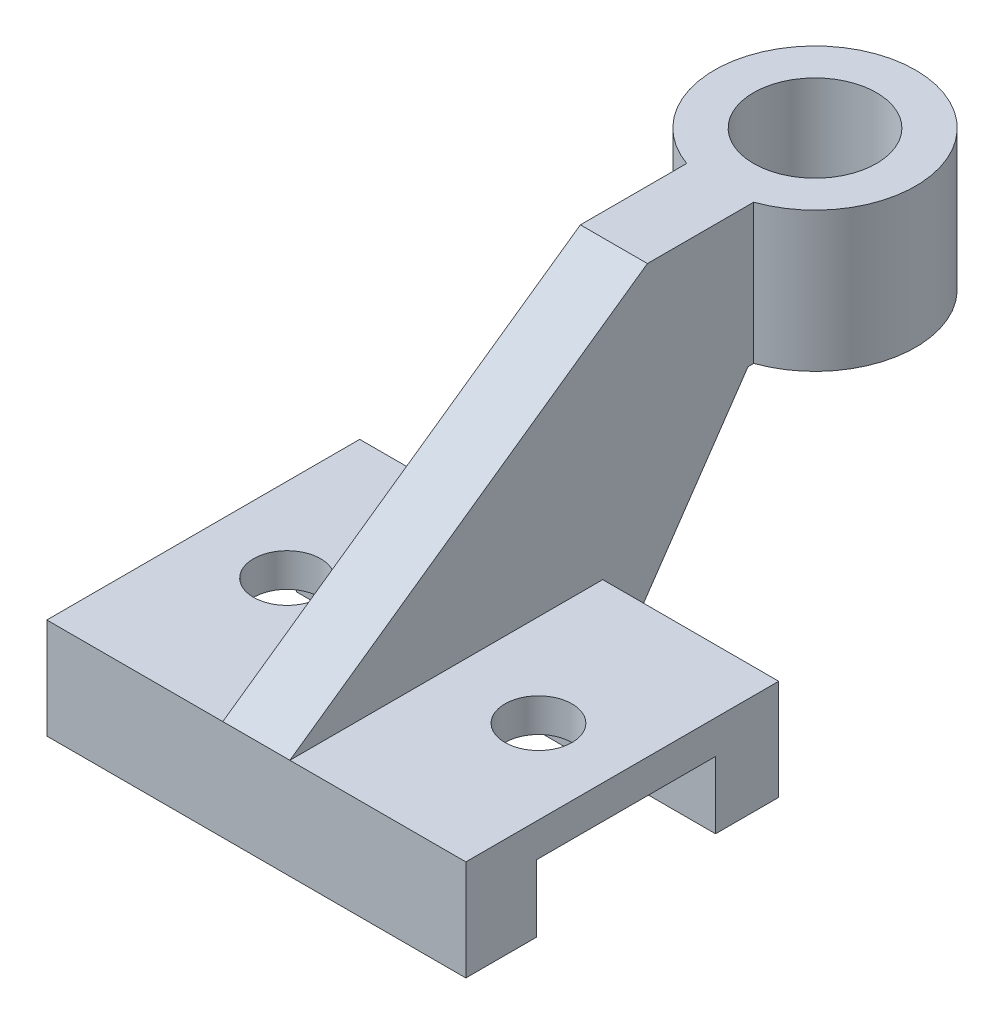
ISO-10303-21;
HEADER;
FILE_DESCRIPTION(('STEP AP214'),'2;1');
FILE_NAME('part.step','',(''),(''),'','','');
FILE_SCHEMA(('AUTOMOTIVE_DESIGN { 1 0 10303 214 1 1 1 1 }'));
ENDSEC;
DATA;
#1=APPLICATION_CONTEXT('core data for automotive mechanical design processes');
#2=APPLICATION_PROTOCOL_DEFINITION('international standard','automotive_design',2000,#1);
#3=PRODUCT_CONTEXT('',#1,'mechanical');
#4=PRODUCT('Part','Part','',(#3));
#5=PRODUCT_RELATED_PRODUCT_CATEGORY('part','',(#4));
#6=PRODUCT_DEFINITION_FORMATION('','',#4);
#7=PRODUCT_DEFINITION_CONTEXT('part definition',#1,'design');
#8=PRODUCT_DEFINITION('design','',#6,#7);
#9=PRODUCT_DEFINITION_SHAPE('','',#8);
#10=(LENGTH_UNIT() NAMED_UNIT(*) SI_UNIT(.MILLI.,.METRE.));
#11=(NAMED_UNIT(*) PLANE_ANGLE_UNIT() SI_UNIT($,.RADIAN.));
#12=(NAMED_UNIT(*) SI_UNIT($,.STERADIAN.) SOLID_ANGLE_UNIT());
#13=UNCERTAINTY_MEASURE_WITH_UNIT(LENGTH_MEASURE(1.E-05),#10,'distance_accuracy_value','');
#14=(GEOMETRIC_REPRESENTATION_CONTEXT(3) GLOBAL_UNCERTAINTY_ASSIGNED_CONTEXT((#13)) GLOBAL_UNIT_ASSIGNED_CONTEXT((#10,
#11,#12)) REPRESENTATION_CONTEXT('',''));
#15=CARTESIAN_POINT('',(0.,0.,0.));
#16=DIRECTION('',(0.,0.,1.));
#17=DIRECTION('',(1.,0.,0.));
#18=AXIS2_PLACEMENT_3D('',#15,#16,#17);
#19=CARTESIAN_POINT('',(952.5,367.568586387434,-1523.46806282722));
#20=DIRECTION('',(0.,1.,0.));
#21=DIRECTION('',(0.,0.,1.));
#22=AXIS2_PLACEMENT_3D('',#19,#20,#21);
#23=CYLINDRICAL_SURFACE('',#22,457.2);
#24=CARTESIAN_POINT('',(952.5,1002.56858638743,-1523.46806282722));
#25=DIRECTION('',(0.,1.,0.));
#26=DIRECTION('',(0.,0.,1.));
#27=AXIS2_PLACEMENT_3D('',#24,#25,#26);
#28=CIRCLE('',#27,457.2);
#29=CARTESIAN_POINT('',(1104.9,1002.56858638743,-1092.4157690159));
#30=VERTEX_POINT('',#29);
#31=CARTESIAN_POINT('',(800.1,1002.56858638743,-1092.4157690159));
#32=VERTEX_POINT('',#31);
#33=EDGE_CURVE('E44',#30,#32,#28,.T.);
#34=ORIENTED_EDGE('',*,*,#33,.F.);
#35=DIRECTION('',(0.,1.,0.));
#36=VECTOR('',#35,1.);
#37=CARTESIAN_POINT('',(1104.9,367.568586387434,-1092.4157690159));
#38=LINE('',#37,#36);
#39=CARTESIAN_POINT('',(1104.9,367.568586387434,-1092.4157690159));
#40=VERTEX_POINT('',#39);
#41=EDGE_CURVE('E152',#30,#40,#38,.F.);
#42=ORIENTED_EDGE('',*,*,#41,.T.);
#43=CARTESIAN_POINT('',(952.5,367.568586387434,-1523.46806282722));
#44=DIRECTION('',(0.,1.,0.));
#45=DIRECTION('',(0.,0.,1.));
#46=AXIS2_PLACEMENT_3D('',#43,#44,#45);
#47=CIRCLE('',#46,457.2);
#48=CARTESIAN_POINT('',(800.1,367.568586387434,-1092.4157690159));
#49=VERTEX_POINT('',#48);
#50=EDGE_CURVE('E11',#40,#49,#47,.T.);
#51=ORIENTED_EDGE('',*,*,#50,.T.);
#52=DIRECTION('',(0.,1.,0.));
#53=VECTOR('',#52,1.);
#54=CARTESIAN_POINT('',(800.1,367.568586387434,-1092.4157690159));
#55=LINE('',#54,#53);
#56=EDGE_CURVE('E311',#49,#32,#55,.T.);
#57=ORIENTED_EDGE('',*,*,#56,.T.);
#58=EDGE_LOOP('',(#34,#42,#51,#57));
#59=FACE_BOUND('',#58,.T.);
#60=ADVANCED_FACE('F41',(#59),#23,.T.);
#61=CARTESIAN_POINT('',(952.5,367.568586387434,-1523.46806282722));
#62=DIRECTION('',(0.,1.,0.));
#63=DIRECTION('',(0.,0.,1.));
#64=AXIS2_PLACEMENT_3D('',#61,#62,#63);
#65=PLANE('',#64);
#66=ORIENTED_EDGE('',*,*,#50,.F.);
#67=DIRECTION('',(0.,0.,1.));
#68=VECTOR('',#67,1.);
#69=CARTESIAN_POINT('',(1104.9,367.568586387434,-1218.66806282722));
#70=LINE('',#69,#68);
#71=CARTESIAN_POINT('',(1104.9,367.568586387434,-1066.26806282722));
#72=VERTEX_POINT('',#71);
#73=EDGE_CURVE('E63',#40,#72,#70,.T.);
#74=ORIENTED_EDGE('',*,*,#73,.T.);
#75=DIRECTION('',(-1.,0.,0.));
#76=VECTOR('',#75,1.);
#77=CARTESIAN_POINT('',(800.1,367.568586387434,-1066.26806282722));
#78=LINE('',#77,#76);
#79=CARTESIAN_POINT('',(800.1,367.568586387434,-1066.26806282722));
#80=VERTEX_POINT('',#79);
#81=EDGE_CURVE('E156',#72,#80,#78,.T.);
#82=ORIENTED_EDGE('',*,*,#81,.T.);
#83=DIRECTION('',(0.,0.,1.));
#84=VECTOR('',#83,1.);
#85=CARTESIAN_POINT('',(800.1,367.568586387434,-1218.66806282722));
#86=LINE('',#85,#84);
#87=EDGE_CURVE('E305',#49,#80,#86,.T.);
#88=ORIENTED_EDGE('',*,*,#87,.F.);
#89=EDGE_LOOP('',(#66,#74,#82,#88));
#90=FACE_BOUND('',#89,.T.);
#91=CARTESIAN_POINT('',(952.5,367.568586387434,-1523.46806282722));
#92=DIRECTION('',(0.,1.,0.));
#93=DIRECTION('',(0.,0.,1.));
#94=AXIS2_PLACEMENT_3D('',#91,#92,#93);
#95=CIRCLE('',#94,279.4);
#96=CARTESIAN_POINT('',(952.5,367.568586387434,-1244.06806282722));
#97=VERTEX_POINT('',#96);
#98=EDGE_CURVE('E318',#97,#97,#95,.T.);
#99=ORIENTED_EDGE('',*,*,#98,.T.);
#100=EDGE_LOOP('',(#99));
#101=FACE_BOUND('',#100,.T.);
#102=ADVANCED_FACE('F328',(#90,#101),#65,.F.);
#103=CARTESIAN_POINT('',(952.5,1002.56858638743,-1523.46806282722));
#104=DIRECTION('',(0.,1.,0.));
#105=DIRECTION('',(0.,0.,1.));
#106=AXIS2_PLACEMENT_3D('',#103,#104,#105);
#107=PLANE('',#106);
#108=ORIENTED_EDGE('',*,*,#33,.T.);
#109=DIRECTION('',(0.,0.,1.));
#110=VECTOR('',#109,1.);
#111=CARTESIAN_POINT('',(800.1,1002.56858638743,-1218.66806282722));
#112=LINE('',#111,#110);
#113=CARTESIAN_POINT('',(800.1,1002.56858638743,-609.068062827224));
#114=VERTEX_POINT('',#113);
#115=EDGE_CURVE('E155',#32,#114,#112,.T.);
#116=ORIENTED_EDGE('',*,*,#115,.T.);
#117=DIRECTION('',(1.,0.,0.));
#118=VECTOR('',#117,1.);
#119=CARTESIAN_POINT('',(800.1,1002.56858638743,-609.068062827224));
#120=LINE('',#119,#118);
#121=CARTESIAN_POINT('',(1104.9,1002.56858638743,-609.068062827224));
#122=VERTEX_POINT('',#121);
#123=EDGE_CURVE('E159',#114,#122,#120,.T.);
#124=ORIENTED_EDGE('',*,*,#123,.T.);
#125=DIRECTION('',(0.,0.,1.));
#126=VECTOR('',#125,1.);
#127=CARTESIAN_POINT('',(1104.9,1002.56858638743,-1218.66806282722));
#128=LINE('',#127,#126);
#129=EDGE_CURVE('E56',#30,#122,#128,.T.);
#130=ORIENTED_EDGE('',*,*,#129,.F.);
#131=EDGE_LOOP('',(#108,#116,#124,#130));
#132=FACE_BOUND('',#131,.T.);
#133=CARTESIAN_POINT('',(952.5,1002.56858638743,-1523.46806282722));
#134=DIRECTION('',(0.,1.,0.));
#135=DIRECTION('',(0.,0.,1.));
#136=AXIS2_PLACEMENT_3D('',#133,#134,#135);
#137=CIRCLE('',#136,279.4);
#138=CARTESIAN_POINT('',(952.5,1002.56858638743,-1244.06806282722));
#139=VERTEX_POINT('',#138);
#140=EDGE_CURVE('E317',#139,#139,#137,.T.);
#141=ORIENTED_EDGE('',*,*,#140,.F.);
#142=EDGE_LOOP('',(#141));
#143=FACE_BOUND('',#142,.T.);
#144=ADVANCED_FACE('F160',(#132,#143),#107,.T.);
#145=CARTESIAN_POINT('',(952.5,367.568586387434,-1523.46806282722));
#146=DIRECTION('',(0.,1.,0.));
#147=DIRECTION('',(0.,0.,1.));
#148=AXIS2_PLACEMENT_3D('',#145,#146,#147);
#149=CYLINDRICAL_SURFACE('',#148,279.4);
#150=CARTESIAN_POINT('',(952.5,367.568586387434,-1244.06806282722));
#151=CARTESIAN_POINT('',(952.5,374.183169720767,-1244.06806282722));
#152=CARTESIAN_POINT('',(952.5,380.7977530541,-1244.06806282722));
#153=CARTESIAN_POINT('',(952.5,394.026919720767,-1244.06806282722));
#154=CARTESIAN_POINT('',(952.5,400.6415030541,-1244.06806282722));
#155=CARTESIAN_POINT('',(952.5,413.870669720767,-1244.06806282722));
#156=CARTESIAN_POINT('',(952.5,420.4852530541,-1244.06806282722));
#157=CARTESIAN_POINT('',(952.5,433.714419720767,-1244.06806282722));
#158=CARTESIAN_POINT('',(952.5,440.3290030541,-1244.06806282722));
#159=CARTESIAN_POINT('',(952.5,453.558169720767,-1244.06806282722));
#160=CARTESIAN_POINT('',(952.5,460.1727530541,-1244.06806282722));
#161=CARTESIAN_POINT('',(952.5,473.401919720767,-1244.06806282722));
#162=CARTESIAN_POINT('',(952.5,480.0165030541,-1244.06806282722));
#163=CARTESIAN_POINT('',(952.5,493.245669720767,-1244.06806282722));
#164=CARTESIAN_POINT('',(952.5,499.8602530541,-1244.06806282722));
#165=CARTESIAN_POINT('',(952.5,513.089419720767,-1244.06806282722));
#166=CARTESIAN_POINT('',(952.5,519.7040030541,-1244.06806282722));
#167=CARTESIAN_POINT('',(952.5,532.933169720767,-1244.06806282722));
#168=CARTESIAN_POINT('',(952.5,539.5477530541,-1244.06806282722));
#169=CARTESIAN_POINT('',(952.5,552.776919720767,-1244.06806282722));
#170=CARTESIAN_POINT('',(952.5,559.3915030541,-1244.06806282722));
#171=CARTESIAN_POINT('',(952.5,572.620669720767,-1244.06806282722));
#172=CARTESIAN_POINT('',(952.5,579.235253054101,-1244.06806282722));
#173=CARTESIAN_POINT('',(952.5,592.464419720767,-1244.06806282722));
#174=CARTESIAN_POINT('',(952.5,599.0790030541,-1244.06806282722));
#175=CARTESIAN_POINT('',(952.5,612.308169720767,-1244.06806282722));
#176=CARTESIAN_POINT('',(952.5,618.9227530541,-1244.06806282722));
#177=CARTESIAN_POINT('',(952.5,632.151919720767,-1244.06806282722));
#178=CARTESIAN_POINT('',(952.5,638.766503054101,-1244.06806282722));
#179=CARTESIAN_POINT('',(952.5,651.995669720767,-1244.06806282722));
#180=CARTESIAN_POINT('',(952.5,658.6102530541,-1244.06806282722));
#181=CARTESIAN_POINT('',(952.5,671.839419720767,-1244.06806282722));
#182=CARTESIAN_POINT('',(952.5,678.4540030541,-1244.06806282722));
#183=CARTESIAN_POINT('',(952.5,691.683169720767,-1244.06806282722));
#184=CARTESIAN_POINT('',(952.5,698.2977530541,-1244.06806282722));
#185=CARTESIAN_POINT('',(952.5,711.526919720767,-1244.06806282722));
#186=CARTESIAN_POINT('',(952.5,718.141503054101,-1244.06806282722));
#187=CARTESIAN_POINT('',(952.5,731.370669720767,-1244.06806282722));
#188=CARTESIAN_POINT('',(952.5,737.9852530541,-1244.06806282722));
#189=CARTESIAN_POINT('',(952.5,751.214419720767,-1244.06806282722));
#190=CARTESIAN_POINT('',(952.5,757.8290030541,-1244.06806282722));
#191=CARTESIAN_POINT('',(952.5,771.058169720767,-1244.06806282722));
#192=CARTESIAN_POINT('',(952.5,777.6727530541,-1244.06806282722));
#193=CARTESIAN_POINT('',(952.5,790.901919720767,-1244.06806282722));
#194=CARTESIAN_POINT('',(952.5,797.5165030541,-1244.06806282722));
#195=CARTESIAN_POINT('',(952.5,810.745669720767,-1244.06806282722));
#196=CARTESIAN_POINT('',(952.5,817.3602530541,-1244.06806282722));
#197=CARTESIAN_POINT('',(952.5,830.589419720767,-1244.06806282722));
#198=CARTESIAN_POINT('',(952.5,837.2040030541,-1244.06806282722));
#199=CARTESIAN_POINT('',(952.5,850.433169720767,-1244.06806282722));
#200=CARTESIAN_POINT('',(952.5,857.047753054101,-1244.06806282722));
#201=CARTESIAN_POINT('',(952.5,870.276919720767,-1244.06806282722));
#202=CARTESIAN_POINT('',(952.5,876.8915030541,-1244.06806282722));
#203=CARTESIAN_POINT('',(952.5,890.120669720767,-1244.06806282722));
#204=CARTESIAN_POINT('',(952.5,896.7352530541,-1244.06806282722));
#205=CARTESIAN_POINT('',(952.5,909.964419720767,-1244.06806282722));
#206=CARTESIAN_POINT('',(952.5,916.5790030541,-1244.06806282722));
#207=CARTESIAN_POINT('',(952.5,929.808169720767,-1244.06806282722));
#208=CARTESIAN_POINT('',(952.5,936.4227530541,-1244.06806282722));
#209=CARTESIAN_POINT('',(952.5,949.651919720767,-1244.06806282722));
#210=CARTESIAN_POINT('',(952.5,956.2665030541,-1244.06806282722));
#211=CARTESIAN_POINT('',(952.5,969.495669720767,-1244.06806282722));
#212=CARTESIAN_POINT('',(952.5,976.1102530541,-1244.06806282722));
#213=CARTESIAN_POINT('',(952.5,989.339419720767,-1244.06806282722));
#214=CARTESIAN_POINT('',(952.5,995.9540030541,-1244.06806282722));
#215=CARTESIAN_POINT('',(952.5,1002.56858638743,-1244.06806282722));
#216=B_SPLINE_CURVE_WITH_KNOTS('',3,(#150,#151,#152,#153,#154,#155,#156,#157,#158,#159,#160,
#161,#162,#163,#164,#165,#166,#167,#168,#169,#170,#171,#172,#173,#174,#175,#176,#177,#178,#179,
#180,#181,#182,#183,#184,#185,#186,#187,#188,#189,#190,#191,#192,#193,#194,#195,#196,#197,#198,
#199,#200,#201,#202,#203,#204,#205,#206,#207,#208,#209,#210,#211,#212,#213,#214,#215),
.UNSPECIFIED.,.F.,.F.,(4,2,2,2,2,2,2,2,2,2,2,2,2,2,2,2,2,2,2,2,2,2,2,2,2,2,2,2,2,2,2,2,4),(0.,
19.84375,39.6875,59.53125,79.375,99.21875,119.0625,138.90625,158.75,178.59375,198.4375,
218.28125,238.125,257.96875,277.8125,297.65625,317.5,337.34375,357.1875,377.03125,396.875,
416.71875,436.5625,456.40625,476.25,496.09375,515.9375,535.78125,555.625,575.46875,595.3125,
615.15625,635.),.UNSPECIFIED.);
#217=EDGE_CURVE('BSEAM326',#97,#139,#216,.T.);
#218=ORIENTED_EDGE('',*,*,#98,.F.);
#219=ORIENTED_EDGE('',*,*,#140,.T.);
#220=ORIENTED_EDGE('',*,*,#217,.T.);
#221=ORIENTED_EDGE('',*,*,#217,.F.);
#222=EDGE_LOOP('',(#218,#220,#219,#221));
#223=FACE_BOUND('',#222,.T.);
#224=ADVANCED_FACE('F326',(#223),#149,.F.);
#225=CARTESIAN_POINT('',(1104.9,367.568586387434,-1218.66806282722));
#226=DIRECTION('',(-1.,0.,0.));
#227=DIRECTION('',(0.,0.,1.));
#228=AXIS2_PLACEMENT_3D('',#225,#226,#227);
#229=PLANE('',#228);
#230=ORIENTED_EDGE('',*,*,#41,.F.);
#231=ORIENTED_EDGE('',*,*,#129,.T.);
#232=DIRECTION('',(0.,-0.575176751990256,0.818029158386142));
#233=VECTOR('',#232,1.);
#234=CARTESIAN_POINT('',(1104.9,1002.56858638743,-609.068062827224));
#235=LINE('',#234,#233);
#236=CARTESIAN_POINT('',(1104.9,-140.431413612566,1016.53193717278));
#237=VERTEX_POINT('',#236);
#238=EDGE_CURVE('E151',#122,#237,#235,.T.);
#239=ORIENTED_EDGE('',*,*,#238,.T.);
#240=DIRECTION('',(0.,0.,-1.));
#241=VECTOR('',#240,1.);
#242=CARTESIAN_POINT('',(1104.9,-140.431413612566,1016.53193717278));
#243=LINE('',#242,#241);
#244=CARTESIAN_POINT('',(1104.9,-140.431413612566,-405.868062827224));
#245=VERTEX_POINT('',#244);
#246=EDGE_CURVE('E173',#237,#245,#243,.T.);
#247=ORIENTED_EDGE('',*,*,#246,.T.);
#248=DIRECTION('',(0.,-1.,0.));
#249=VECTOR('',#248,1.);
#250=CARTESIAN_POINT('',(1104.9,-140.431413612566,-405.868062827224));
#251=LINE('',#250,#249);
#252=CARTESIAN_POINT('',(1104.9,-597.631413612566,-405.868062827224));
#253=VERTEX_POINT('',#252);
#254=EDGE_CURVE('E178',#245,#253,#251,.T.);
#255=ORIENTED_EDGE('',*,*,#254,.T.);
#256=DIRECTION('',(0.,0.825307261249832,-0.56468391559199));
#257=VECTOR('',#256,1.);
#258=CARTESIAN_POINT('',(1104.9,367.568586387434,-1066.26806282722));
#259=LINE('',#258,#257);
#260=EDGE_CURVE('E190',#253,#72,#259,.T.);
#261=ORIENTED_EDGE('',*,*,#260,.T.);
#262=ORIENTED_EDGE('',*,*,#73,.F.);
#263=EDGE_LOOP('',(#230,#231,#239,#247,#255,#261,#262));
#264=FACE_BOUND('',#263,.T.);
#265=ADVANCED_FACE('F148',(#264),#229,.F.);
#266=CARTESIAN_POINT('',(800.1,1002.56858638743,-1218.66806282722));
#267=DIRECTION('',(1.,0.,0.));
#268=DIRECTION('',(0.,0.,-1.));
#269=AXIS2_PLACEMENT_3D('',#266,#267,#268);
#270=PLANE('',#269);
#271=ORIENTED_EDGE('',*,*,#56,.F.);
#272=ORIENTED_EDGE('',*,*,#87,.T.);
#273=DIRECTION('',(0.,0.825307261249832,-0.56468391559199));
#274=VECTOR('',#273,1.);
#275=CARTESIAN_POINT('',(800.1,367.568586387434,-1066.26806282722));
#276=LINE('',#275,#274);
#277=CARTESIAN_POINT('',(800.1,-597.631413612566,-405.868062827224));
#278=VERTEX_POINT('',#277);
#279=EDGE_CURVE('E167',#278,#80,#276,.T.);
#280=ORIENTED_EDGE('',*,*,#279,.F.);
#281=DIRECTION('',(0.,-1.,0.));
#282=VECTOR('',#281,1.);
#283=CARTESIAN_POINT('',(800.1,-140.431413612566,-405.868062827224));
#284=LINE('',#283,#282);
#285=CARTESIAN_POINT('',(800.1,-140.431413612566,-405.868062827224));
#286=VERTEX_POINT('',#285);
#287=EDGE_CURVE('E199',#286,#278,#284,.T.);
#288=ORIENTED_EDGE('',*,*,#287,.F.);
#289=DIRECTION('',(0.,0.,-1.));
#290=VECTOR('',#289,1.);
#291=CARTESIAN_POINT('',(800.1,-140.431413612566,1016.53193717278));
#292=LINE('',#291,#290);
#293=CARTESIAN_POINT('',(800.1,-140.431413612566,1016.53193717278));
#294=VERTEX_POINT('',#293);
#295=EDGE_CURVE('E196',#294,#286,#292,.T.);
#296=ORIENTED_EDGE('',*,*,#295,.F.);
#297=DIRECTION('',(0.,-0.575176751990256,0.818029158386142));
#298=VECTOR('',#297,1.);
#299=CARTESIAN_POINT('',(800.1,1002.56858638743,-609.068062827224));
#300=LINE('',#299,#298);
#301=EDGE_CURVE('E193',#114,#294,#300,.T.);
#302=ORIENTED_EDGE('',*,*,#301,.F.);
#303=ORIENTED_EDGE('',*,*,#115,.F.);
#304=EDGE_LOOP('',(#271,#272,#280,#288,#296,#302,#303));
#305=FACE_BOUND('',#304,.T.);
#306=ADVANCED_FACE('F345',(#305),#270,.F.);
#307=CARTESIAN_POINT('',(1905.,-140.431413612566,-405.868062827224));
#308=DIRECTION('',(0.,0.,-1.));
#309=DIRECTION('',(0.,1.,0.));
#310=AXIS2_PLACEMENT_3D('',#307,#308,#309);
#311=PLANE('',#310);
#312=DIRECTION('',(-1.,0.,0.));
#313=VECTOR('',#312,1.);
#314=CARTESIAN_POINT('',(1905.,-597.631413612566,-405.868062827224));
#315=LINE('',#314,#313);
#316=CARTESIAN_POINT('',(1905.,-597.631413612566,-405.868062827224));
#317=VERTEX_POINT('',#316);
#318=EDGE_CURVE('E296',#317,#253,#315,.T.);
#319=ORIENTED_EDGE('',*,*,#318,.T.);
#320=ORIENTED_EDGE('',*,*,#254,.F.);
#321=DIRECTION('',(-1.,0.,0.));
#322=VECTOR('',#321,1.);
#323=CARTESIAN_POINT('',(1905.,-140.431413612566,-405.868062827224));
#324=LINE('',#323,#322);
#325=CARTESIAN_POINT('',(1905.,-140.431413612566,-405.868062827224));
#326=VERTEX_POINT('',#325);
#327=EDGE_CURVE('E268',#326,#245,#324,.T.);
#328=ORIENTED_EDGE('',*,*,#327,.F.);
#329=DIRECTION('',(0.,-1.,0.));
#330=VECTOR('',#329,1.);
#331=CARTESIAN_POINT('',(1905.,-140.431413612566,-405.868062827224));
#332=LINE('',#331,#330);
#333=EDGE_CURVE('E211',#326,#317,#332,.T.);
#334=ORIENTED_EDGE('',*,*,#333,.T.);
#335=EDGE_LOOP('',(#319,#320,#328,#334));
#336=FACE_BOUND('',#335,.T.);
#337=ADVANCED_FACE('F353',(#336),#311,.T.);
#338=CARTESIAN_POINT('',(1905.,-140.431413612566,1016.53193717278));
#339=DIRECTION('',(0.,1.,0.));
#340=DIRECTION('',(0.,0.,1.));
#341=AXIS2_PLACEMENT_3D('',#338,#339,#340);
#342=PLANE('',#341);
#343=CARTESIAN_POINT('',(1524.,-140.431413612566,305.331937172776));
#344=DIRECTION('',(0.,1.,0.));
#345=DIRECTION('',(0.,0.,1.));
#346=AXIS2_PLACEMENT_3D('',#343,#344,#345);
#347=CIRCLE('',#346,152.4);
#348=CARTESIAN_POINT('',(1524.,-140.431413612566,457.731937172776));
#349=VERTEX_POINT('',#348);
#350=EDGE_CURVE('E181',#349,#349,#347,.T.);
#351=ORIENTED_EDGE('',*,*,#350,.F.);
#352=EDGE_LOOP('',(#351));
#353=FACE_BOUND('',#352,.T.);
#354=ORIENTED_EDGE('',*,*,#327,.T.);
#355=ORIENTED_EDGE('',*,*,#246,.F.);
#356=DIRECTION('',(-1.,0.,0.));
#357=VECTOR('',#356,1.);
#358=CARTESIAN_POINT('',(1905.,-140.431413612566,1016.53193717278));
#359=LINE('',#358,#357);
#360=CARTESIAN_POINT('',(1905.,-140.431413612566,1016.53193717278));
#361=VERTEX_POINT('',#360);
#362=EDGE_CURVE('E273',#361,#237,#359,.T.);
#363=ORIENTED_EDGE('',*,*,#362,.F.);
#364=DIRECTION('',(0.,0.,-1.));
#365=VECTOR('',#364,1.);
#366=CARTESIAN_POINT('',(1905.,-140.431413612566,1016.53193717278));
#367=LINE('',#366,#365);
#368=EDGE_CURVE('E236',#361,#326,#367,.T.);
#369=ORIENTED_EDGE('',*,*,#368,.T.);
#370=EDGE_LOOP('',(#354,#355,#363,#369));
#371=FACE_BOUND('',#370,.T.);
#372=ADVANCED_FACE('F356',(#353,#371),#342,.T.);
#373=ORIENTED_EDGE('',*,*,#287,.T.);
#374=CARTESIAN_POINT('',(0.,-597.631413612566,-405.868062827224));
#375=VERTEX_POINT('',#374);
#376=EDGE_CURVE('E240',#278,#375,#315,.T.);
#377=ORIENTED_EDGE('',*,*,#376,.T.);
#378=DIRECTION('',(0.,-1.,0.));
#379=VECTOR('',#378,1.);
#380=CARTESIAN_POINT('',(0.,-140.431413612566,-405.868062827224));
#381=LINE('',#380,#379);
#382=CARTESIAN_POINT('',(0.,-140.431413612566,-405.868062827224));
#383=VERTEX_POINT('',#382);
#384=EDGE_CURVE('E208',#383,#375,#381,.T.);
#385=ORIENTED_EDGE('',*,*,#384,.F.);
#386=EDGE_CURVE('E272',#286,#383,#324,.T.);
#387=ORIENTED_EDGE('',*,*,#386,.F.);
#388=EDGE_LOOP('',(#373,#377,#385,#387));
#389=FACE_BOUND('',#388,.T.);
#390=ADVANCED_FACE('F371',(#389),#311,.T.);
#391=CARTESIAN_POINT('',(381.,-140.431413612566,305.331937172776));
#392=DIRECTION('',(0.,1.,0.));
#393=DIRECTION('',(0.,0.,1.));
#394=AXIS2_PLACEMENT_3D('',#391,#392,#393);
#395=CIRCLE('',#394,152.4);
#396=CARTESIAN_POINT('',(381.,-140.431413612566,457.731937172776));
#397=VERTEX_POINT('',#396);
#398=EDGE_CURVE('E410',#397,#397,#395,.T.);
#399=ORIENTED_EDGE('',*,*,#398,.F.);
#400=EDGE_LOOP('',(#399));
#401=FACE_BOUND('',#400,.T.);
#402=ORIENTED_EDGE('',*,*,#295,.T.);
#403=ORIENTED_EDGE('',*,*,#386,.T.);
#404=DIRECTION('',(0.,0.,-1.));
#405=VECTOR('',#404,1.);
#406=CARTESIAN_POINT('',(0.,-140.431413612566,1016.53193717278));
#407=LINE('',#406,#405);
#408=CARTESIAN_POINT('',(0.,-140.431413612566,1016.53193717278));
#409=VERTEX_POINT('',#408);
#410=EDGE_CURVE('E216',#409,#383,#407,.T.);
#411=ORIENTED_EDGE('',*,*,#410,.F.);
#412=EDGE_CURVE('E277',#294,#409,#359,.T.);
#413=ORIENTED_EDGE('',*,*,#412,.F.);
#414=EDGE_LOOP('',(#402,#403,#411,#413));
#415=FACE_BOUND('',#414,.T.);
#416=ADVANCED_FACE('F385',(#401,#415),#342,.T.);
#417=CARTESIAN_POINT('',(1905.,-597.631413612566,1016.53193717278));
#418=DIRECTION('',(0.,0.,1.));
#419=DIRECTION('',(1.,0.,0.));
#420=AXIS2_PLACEMENT_3D('',#417,#418,#419);
#421=PLANE('',#420);
#422=DIRECTION('',(0.,1.,0.));
#423=VECTOR('',#422,1.);
#424=CARTESIAN_POINT('',(0.,-597.631413612566,1016.53193717278));
#425=LINE('',#424,#423);
#426=CARTESIAN_POINT('',(0.,-597.631413612566,1016.53193717278));
#427=VERTEX_POINT('',#426);
#428=EDGE_CURVE('E261',#427,#409,#425,.T.);
#429=ORIENTED_EDGE('',*,*,#428,.F.);
#430=DIRECTION('',(-1.,0.,0.));
#431=VECTOR('',#430,1.);
#432=CARTESIAN_POINT('',(1905.,-597.631413612566,1016.53193717278));
#433=LINE('',#432,#431);
#434=CARTESIAN_POINT('',(1905.,-597.631413612566,1016.53193717278));
#435=VERTEX_POINT('',#434);
#436=EDGE_CURVE('E278',#435,#427,#433,.T.);
#437=ORIENTED_EDGE('',*,*,#436,.F.);
#438=DIRECTION('',(0.,1.,0.));
#439=VECTOR('',#438,1.);
#440=CARTESIAN_POINT('',(1905.,-597.631413612566,1016.53193717278));
#441=LINE('',#440,#439);
#442=EDGE_CURVE('E232',#435,#361,#441,.T.);
#443=ORIENTED_EDGE('',*,*,#442,.T.);
#444=ORIENTED_EDGE('',*,*,#362,.T.);
#445=DIRECTION('',(1.,0.,0.));
#446=VECTOR('',#445,1.);
#447=CARTESIAN_POINT('',(800.1,-140.431413612566,1016.53193717278));
#448=LINE('',#447,#446);
#449=EDGE_CURVE('E166',#294,#237,#448,.T.);
#450=ORIENTED_EDGE('',*,*,#449,.F.);
#451=ORIENTED_EDGE('',*,*,#412,.T.);
#452=EDGE_LOOP('',(#429,#437,#443,#444,#450,#451));
#453=FACE_BOUND('',#452,.T.);
#454=ADVANCED_FACE('F380',(#453),#421,.T.);
#455=CARTESIAN_POINT('',(1905.,-597.631413612566,1016.53193717278));
#456=DIRECTION('',(0.,1.,0.));
#457=DIRECTION('',(0.,0.,1.));
#458=AXIS2_PLACEMENT_3D('',#455,#456,#457);
#459=PLANE('',#458);
#460=DIRECTION('',(0.,0.,-1.));
#461=VECTOR('',#460,1.);
#462=CARTESIAN_POINT('',(0.,-597.631413612566,1016.53193717278));
#463=LINE('',#462,#461);
#464=CARTESIAN_POINT('',(0.,-597.631413612566,694.178010471205));
#465=VERTEX_POINT('',#464);
#466=EDGE_CURVE('E258',#427,#465,#463,.T.);
#467=ORIENTED_EDGE('',*,*,#466,.T.);
#468=DIRECTION('',(-1.,0.,0.));
#469=VECTOR('',#468,1.);
#470=CARTESIAN_POINT('',(1905.,-597.631413612566,694.178010471205));
#471=LINE('',#470,#469);
#472=CARTESIAN_POINT('',(1905.,-597.631413612566,694.178010471205));
#473=VERTEX_POINT('',#472);
#474=EDGE_CURVE('E281',#473,#465,#471,.T.);
#475=ORIENTED_EDGE('',*,*,#474,.F.);
#476=DIRECTION('',(0.,0.,-1.));
#477=VECTOR('',#476,1.);
#478=CARTESIAN_POINT('',(1905.,-597.631413612566,1016.53193717278));
#479=LINE('',#478,#477);
#480=EDGE_CURVE('E229',#435,#473,#479,.T.);
#481=ORIENTED_EDGE('',*,*,#480,.F.);
#482=ORIENTED_EDGE('',*,*,#436,.T.);
#483=EDGE_LOOP('',(#467,#475,#481,#482));
#484=FACE_BOUND('',#483,.T.);
#485=ADVANCED_FACE('F393',(#484),#459,.F.);
#486=CARTESIAN_POINT('',(1905.,-597.631413612566,694.178010471205));
#487=DIRECTION('',(0.,0.,1.));
#488=DIRECTION('',(1.,0.,0.));
#489=AXIS2_PLACEMENT_3D('',#486,#487,#488);
#490=PLANE('',#489);
#491=DIRECTION('',(0.,1.,0.));
#492=VECTOR('',#491,1.);
#493=CARTESIAN_POINT('',(0.,-597.631413612566,694.178010471205));
#494=LINE('',#493,#492);
#495=CARTESIAN_POINT('',(0.,-292.831413612566,694.178010471205));
#496=VERTEX_POINT('',#495);
#497=EDGE_CURVE('E255',#465,#496,#494,.T.);
#498=ORIENTED_EDGE('',*,*,#497,.T.);
#499=DIRECTION('',(-1.,0.,0.));
#500=VECTOR('',#499,1.);
#501=CARTESIAN_POINT('',(1905.,-292.831413612566,694.178010471205));
#502=LINE('',#501,#500);
#503=CARTESIAN_POINT('',(1905.,-292.831413612566,694.178010471205));
#504=VERTEX_POINT('',#503);
#505=EDGE_CURVE('E285',#504,#496,#502,.T.);
#506=ORIENTED_EDGE('',*,*,#505,.F.);
#507=DIRECTION('',(0.,1.,0.));
#508=VECTOR('',#507,1.);
#509=CARTESIAN_POINT('',(1905.,-597.631413612566,694.178010471205));
#510=LINE('',#509,#508);
#511=EDGE_CURVE('E226',#473,#504,#510,.T.);
#512=ORIENTED_EDGE('',*,*,#511,.F.);
#513=ORIENTED_EDGE('',*,*,#474,.T.);
#514=EDGE_LOOP('',(#498,#506,#512,#513));
#515=FACE_BOUND('',#514,.T.);
#516=ADVANCED_FACE('F425',(#515),#490,.F.);
#517=CARTESIAN_POINT('',(1905.,-292.831413612566,694.178010471205));
#518=DIRECTION('',(0.,1.,0.));
#519=DIRECTION('',(0.,0.,1.));
#520=AXIS2_PLACEMENT_3D('',#517,#518,#519);
#521=PLANE('',#520);
#522=CARTESIAN_POINT('',(1524.,-292.831413612566,305.331937172776));
#523=DIRECTION('',(0.,1.,0.));
#524=DIRECTION('',(0.,0.,1.));
#525=AXIS2_PLACEMENT_3D('',#522,#523,#524);
#526=CIRCLE('',#525,152.4);
#527=CARTESIAN_POINT('',(1524.,-292.831413612566,457.731937172776));
#528=VERTEX_POINT('',#527);
#529=EDGE_CURVE('E174',#528,#528,#526,.F.);
#530=ORIENTED_EDGE('',*,*,#529,.F.);
#531=EDGE_LOOP('',(#530));
#532=FACE_BOUND('',#531,.T.);
#533=CARTESIAN_POINT('',(381.,-292.831413612566,305.331937172776));
#534=DIRECTION('',(0.,1.,0.));
#535=DIRECTION('',(0.,0.,1.));
#536=AXIS2_PLACEMENT_3D('',#533,#534,#535);
#537=CIRCLE('',#536,152.4);
#538=CARTESIAN_POINT('',(381.,-292.831413612566,457.731937172776));
#539=VERTEX_POINT('',#538);
#540=EDGE_CURVE('E184',#539,#539,#537,.F.);
#541=ORIENTED_EDGE('',*,*,#540,.F.);
#542=EDGE_LOOP('',(#541));
#543=FACE_BOUND('',#542,.T.);
#544=DIRECTION('',(0.,0.,-1.));
#545=VECTOR('',#544,1.);
#546=CARTESIAN_POINT('',(0.,-292.831413612566,694.178010471205));
#547=LINE('',#546,#545);
#548=CARTESIAN_POINT('',(0.,-292.831413612566,-118.621989528795));
#549=VERTEX_POINT('',#548);
#550=EDGE_CURVE('E252',#496,#549,#547,.T.);
#551=ORIENTED_EDGE('',*,*,#550,.T.);
#552=DIRECTION('',(-1.,0.,0.));
#553=VECTOR('',#552,1.);
#554=CARTESIAN_POINT('',(1905.,-292.831413612566,-118.621989528795));
#555=LINE('',#554,#553);
#556=CARTESIAN_POINT('',(1905.,-292.831413612566,-118.621989528795));
#557=VERTEX_POINT('',#556);
#558=EDGE_CURVE('E289',#557,#549,#555,.T.);
#559=ORIENTED_EDGE('',*,*,#558,.F.);
#560=DIRECTION('',(0.,0.,-1.));
#561=VECTOR('',#560,1.);
#562=CARTESIAN_POINT('',(1905.,-292.831413612566,694.178010471205));
#563=LINE('',#562,#561);
#564=EDGE_CURVE('E223',#504,#557,#563,.T.);
#565=ORIENTED_EDGE('',*,*,#564,.F.);
#566=ORIENTED_EDGE('',*,*,#505,.T.);
#567=EDGE_LOOP('',(#551,#559,#565,#566));
#568=FACE_BOUND('',#567,.T.);
#569=ADVANCED_FACE('F421',(#532,#543,#568),#521,.F.);
#570=CARTESIAN_POINT('',(1905.,-292.831413612566,-118.621989528795));
#571=DIRECTION('',(0.,0.,-1.));
#572=DIRECTION('',(0.,1.,0.));
#573=AXIS2_PLACEMENT_3D('',#570,#571,#572);
#574=PLANE('',#573);
#575=DIRECTION('',(0.,-1.,0.));
#576=VECTOR('',#575,1.);
#577=CARTESIAN_POINT('',(0.,-292.831413612566,-118.621989528795));
#578=LINE('',#577,#576);
#579=CARTESIAN_POINT('',(0.,-597.631413612566,-118.621989528795));
#580=VERTEX_POINT('',#579);
#581=EDGE_CURVE('E248',#549,#580,#578,.T.);
#582=ORIENTED_EDGE('',*,*,#581,.T.);
#583=DIRECTION('',(-1.,0.,0.));
#584=VECTOR('',#583,1.);
#585=CARTESIAN_POINT('',(1905.,-597.631413612566,-118.621989528795));
#586=LINE('',#585,#584);
#587=CARTESIAN_POINT('',(1905.,-597.631413612566,-118.621989528795));
#588=VERTEX_POINT('',#587);
#589=EDGE_CURVE('E293',#588,#580,#586,.T.);
#590=ORIENTED_EDGE('',*,*,#589,.F.);
#591=DIRECTION('',(0.,-1.,0.));
#592=VECTOR('',#591,1.);
#593=CARTESIAN_POINT('',(1905.,-292.831413612566,-118.621989528795));
#594=LINE('',#593,#592);
#595=EDGE_CURVE('E220',#557,#588,#594,.T.);
#596=ORIENTED_EDGE('',*,*,#595,.F.);
#597=ORIENTED_EDGE('',*,*,#558,.T.);
#598=EDGE_LOOP('',(#582,#590,#596,#597));
#599=FACE_BOUND('',#598,.T.);
#600=ADVANCED_FACE('F424',(#599),#574,.F.);
#601=CARTESIAN_POINT('',(1905.,-597.631413612566,-405.868062827224));
#602=DIRECTION('',(0.,-1.,0.));
#603=DIRECTION('',(0.,0.,-1.));
#604=AXIS2_PLACEMENT_3D('',#601,#602,#603);
#605=PLANE('',#604);
#606=DIRECTION('',(0.,0.,1.));
#607=VECTOR('',#606,1.);
#608=CARTESIAN_POINT('',(0.,-597.631413612566,-405.868062827224));
#609=LINE('',#608,#607);
#610=EDGE_CURVE('E244',#375,#580,#609,.T.);
#611=ORIENTED_EDGE('',*,*,#610,.F.);
#612=ORIENTED_EDGE('',*,*,#376,.F.);
#613=DIRECTION('',(1.,0.,0.));
#614=VECTOR('',#613,1.);
#615=CARTESIAN_POINT('',(800.1,-597.631413612566,-405.868062827224));
#616=LINE('',#615,#614);
#617=EDGE_CURVE('E205',#278,#253,#616,.T.);
#618=ORIENTED_EDGE('',*,*,#617,.T.);
#619=ORIENTED_EDGE('',*,*,#318,.F.);
#620=DIRECTION('',(0.,0.,1.));
#621=VECTOR('',#620,1.);
#622=CARTESIAN_POINT('',(1905.,-597.631413612566,-405.868062827224));
#623=LINE('',#622,#621);
#624=EDGE_CURVE('E215',#317,#588,#623,.T.);
#625=ORIENTED_EDGE('',*,*,#624,.T.);
#626=ORIENTED_EDGE('',*,*,#589,.T.);
#627=EDGE_LOOP('',(#611,#612,#618,#619,#625,#626));
#628=FACE_BOUND('',#627,.T.);
#629=ADVANCED_FACE('F366',(#628),#605,.T.);
#630=CARTESIAN_POINT('',(1905.,0.,0.));
#631=DIRECTION('',(-1.,0.,0.));
#632=DIRECTION('',(0.,0.,1.));
#633=AXIS2_PLACEMENT_3D('',#630,#631,#632);
#634=PLANE('',#633);
#635=ORIENTED_EDGE('',*,*,#333,.F.);
#636=ORIENTED_EDGE('',*,*,#368,.F.);
#637=ORIENTED_EDGE('',*,*,#442,.F.);
#638=ORIENTED_EDGE('',*,*,#480,.T.);
#639=ORIENTED_EDGE('',*,*,#511,.T.);
#640=ORIENTED_EDGE('',*,*,#564,.T.);
#641=ORIENTED_EDGE('',*,*,#595,.T.);
#642=ORIENTED_EDGE('',*,*,#624,.F.);
#643=EDGE_LOOP('',(#635,#636,#637,#638,#639,#640,#641,#642));
#644=FACE_BOUND('',#643,.T.);
#645=ADVANCED_FACE('F360',(#644),#634,.F.);
#646=CARTESIAN_POINT('',(0.,0.,0.));
#647=DIRECTION('',(-1.,0.,0.));
#648=DIRECTION('',(0.,0.,1.));
#649=AXIS2_PLACEMENT_3D('',#646,#647,#648);
#650=PLANE('',#649);
#651=ORIENTED_EDGE('',*,*,#384,.T.);
#652=ORIENTED_EDGE('',*,*,#610,.T.);
#653=ORIENTED_EDGE('',*,*,#581,.F.);
#654=ORIENTED_EDGE('',*,*,#550,.F.);
#655=ORIENTED_EDGE('',*,*,#497,.F.);
#656=ORIENTED_EDGE('',*,*,#466,.F.);
#657=ORIENTED_EDGE('',*,*,#428,.T.);
#658=ORIENTED_EDGE('',*,*,#410,.T.);
#659=EDGE_LOOP('',(#651,#652,#653,#654,#655,#656,#657,#658));
#660=FACE_BOUND('',#659,.T.);
#661=ADVANCED_FACE('F383',(#660),#650,.T.);
#662=CARTESIAN_POINT('',(800.1,367.568586387434,-1066.26806282722));
#663=DIRECTION('',(0.,-0.56468391559199,-0.825307261249832));
#664=DIRECTION('',(0.,0.825307261249832,-0.56468391559199));
#665=AXIS2_PLACEMENT_3D('',#662,#663,#664);
#666=PLANE('',#665);
#667=ORIENTED_EDGE('',*,*,#81,.F.);
#668=ORIENTED_EDGE('',*,*,#260,.F.);
#669=ORIENTED_EDGE('',*,*,#617,.F.);
#670=ORIENTED_EDGE('',*,*,#279,.T.);
#671=EDGE_LOOP('',(#667,#668,#669,#670));
#672=FACE_BOUND('',#671,.T.);
#673=ADVANCED_FACE('F350',(#672),#666,.T.);
#674=CARTESIAN_POINT('',(800.1,1002.56858638743,-609.068062827224));
#675=DIRECTION('',(0.,0.818029158386142,0.575176751990256));
#676=DIRECTION('',(0.,-0.575176751990256,0.818029158386142));
#677=AXIS2_PLACEMENT_3D('',#674,#675,#676);
#678=PLANE('',#677);
#679=ORIENTED_EDGE('',*,*,#449,.T.);
#680=ORIENTED_EDGE('',*,*,#238,.F.);
#681=ORIENTED_EDGE('',*,*,#123,.F.);
#682=ORIENTED_EDGE('',*,*,#301,.T.);
#683=EDGE_LOOP('',(#679,#680,#681,#682));
#684=FACE_BOUND('',#683,.T.);
#685=ADVANCED_FACE('F170',(#684),#678,.T.);
#686=CARTESIAN_POINT('',(381.,-597.632413612566,305.331937172776));
#687=DIRECTION('',(0.,1.,0.));
#688=DIRECTION('',(0.,0.,1.));
#689=AXIS2_PLACEMENT_3D('',#686,#687,#688);
#690=CYLINDRICAL_SURFACE('',#689,152.4);
#691=ORIENTED_EDGE('',*,*,#398,.T.);
#692=EDGE_LOOP('',(#691));
#693=FACE_BOUND('',#692,.T.);
#694=ORIENTED_EDGE('',*,*,#540,.T.);
#695=EDGE_LOOP('',(#694));
#696=FACE_BOUND('',#695,.T.);
#697=ADVANCED_FACE('F414',(#693,#696),#690,.F.);
#698=CARTESIAN_POINT('',(1524.,-597.632413612566,305.331937172776));
#699=DIRECTION('',(0.,1.,0.));
#700=DIRECTION('',(0.,0.,1.));
#701=AXIS2_PLACEMENT_3D('',#698,#699,#700);
#702=CYLINDRICAL_SURFACE('',#701,152.4);
#703=ORIENTED_EDGE('',*,*,#350,.T.);
#704=EDGE_LOOP('',(#703));
#705=FACE_BOUND('',#704,.T.);
#706=ORIENTED_EDGE('',*,*,#529,.T.);
#707=EDGE_LOOP('',(#706));
#708=FACE_BOUND('',#707,.T.);
#709=ADVANCED_FACE('F417',(#705,#708),#702,.F.);
#710=CLOSED_SHELL('',(#60,#102,#144,#224,#265,#306,#337,#372,#390,#416,#454,#485,#516,#569,#600,
#629,#645,#661,#673,#685,#697,#709));
#711=MANIFOLD_SOLID_BREP('B2',#710);
#712=ADVANCED_BREP_SHAPE_REPRESENTATION('',(#18,#711),#14);
#713=SHAPE_DEFINITION_REPRESENTATION(#9,#712);
ENDSEC;
END-ISO-10303-21;
